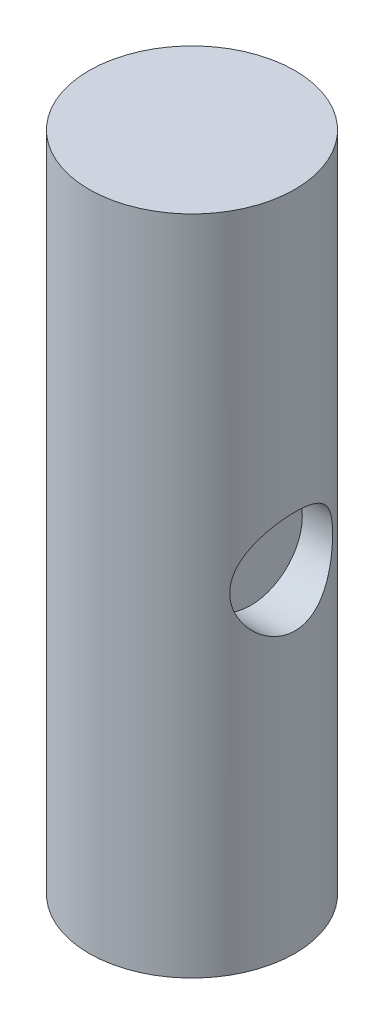
ISO-10303-21;
HEADER;
FILE_DESCRIPTION(('STEP AP214'),'2;1');
FILE_NAME('part.step','',(''),(''),'','','');
FILE_SCHEMA(('AUTOMOTIVE_DESIGN { 1 0 10303 214 1 1 1 1 }'));
ENDSEC;
DATA;
#1=APPLICATION_CONTEXT('core data for automotive mechanical design processes');
#2=APPLICATION_PROTOCOL_DEFINITION('international standard','automotive_design',2000,#1);
#3=PRODUCT_CONTEXT('',#1,'mechanical');
#4=PRODUCT('Part','Part','',(#3));
#5=PRODUCT_RELATED_PRODUCT_CATEGORY('part','',(#4));
#6=PRODUCT_DEFINITION_FORMATION('','',#4);
#7=PRODUCT_DEFINITION_CONTEXT('part definition',#1,'design');
#8=PRODUCT_DEFINITION('design','',#6,#7);
#9=PRODUCT_DEFINITION_SHAPE('','',#8);
#10=(LENGTH_UNIT() NAMED_UNIT(*) SI_UNIT(.MILLI.,.METRE.));
#11=(NAMED_UNIT(*) PLANE_ANGLE_UNIT() SI_UNIT($,.RADIAN.));
#12=(NAMED_UNIT(*) SI_UNIT($,.STERADIAN.) SOLID_ANGLE_UNIT());
#13=UNCERTAINTY_MEASURE_WITH_UNIT(LENGTH_MEASURE(1.E-05),#10,'distance_accuracy_value','');
#14=(GEOMETRIC_REPRESENTATION_CONTEXT(3) GLOBAL_UNCERTAINTY_ASSIGNED_CONTEXT((#13)) GLOBAL_UNIT_ASSIGNED_CONTEXT((#10,
#11,#12)) REPRESENTATION_CONTEXT('',''));
#15=CARTESIAN_POINT('',(0.,0.,0.));
#16=DIRECTION('',(0.,0.,1.));
#17=DIRECTION('',(1.,0.,0.));
#18=AXIS2_PLACEMENT_3D('',#15,#16,#17);
#19=CARTESIAN_POINT('',(0.,45.,0.));
#20=DIRECTION('',(0.,-1.,0.));
#21=DIRECTION('',(0.,0.,-1.));
#22=AXIS2_PLACEMENT_3D('',#19,#20,#21);
#23=CYLINDRICAL_SURFACE('',#22,7.);
#24=CARTESIAN_POINT('',(6.06217782649107,22.5,-3.5));
#25=CARTESIAN_POINT('',(6.06217838000061,22.4087678397001,-3.49999956339732));
#26=CARTESIAN_POINT('',(6.06424447605956,22.3175275619315,-3.49642792389145));
#27=CARTESIAN_POINT('',(6.07243150824313,22.1357513494497,-3.48218913508999));
#28=CARTESIAN_POINT('',(6.07855433209937,22.045215762506,-3.47151868246889));
#29=CARTESIAN_POINT('',(6.09464039096269,21.8654405017537,-3.44319969467244));
#30=CARTESIAN_POINT('',(6.10460964860236,21.7762030891142,-3.42554021516251));
#31=CARTESIAN_POINT('',(6.12802725620062,21.5997877798301,-3.38346810867625));
#32=CARTESIAN_POINT('',(6.1414771178296,21.5126107960543,-3.35905254712793));
#33=CARTESIAN_POINT('',(6.18621982567766,21.2560219225557,-3.27637383514563));
#34=CARTESIAN_POINT('',(6.22201962971363,21.0903861118881,-3.20849068342822));
#35=CARTESIAN_POINT('',(6.30149515669602,20.7729878953145,-3.04943048822246));
#36=CARTESIAN_POINT('',(6.34517130568186,20.621226240545,-2.95825218456469));
#37=CARTESIAN_POINT('',(6.43989014203716,20.3219373472097,-2.74633222566438));
#38=CARTESIAN_POINT('',(6.49124329448661,20.1757917304875,-2.62377249633983));
#39=CARTESIAN_POINT('',(6.59301832981095,19.9050719358753,-2.35639796160147));
#40=CARTESIAN_POINT('',(6.64343973703042,19.7805085179582,-2.21157212276478));
#41=CARTESIAN_POINT('',(6.74175654692166,19.5482015355274,-1.89167303586647));
#42=CARTESIAN_POINT('',(6.7892525767614,19.4421577351831,-1.71521894349515));
#43=CARTESIAN_POINT('',(6.85154168585872,19.3070085831557,-1.43717634193612));
#44=CARTESIAN_POINT('',(6.87081779646073,19.2659340128136,-1.34223033670876));
#45=CARTESIAN_POINT('',(6.9058351653357,19.1921880594991,-1.14851918972932));
#46=CARTESIAN_POINT('',(6.92157840843028,19.1595119566255,-1.0497562291509));
#47=CARTESIAN_POINT('',(6.94806564699471,19.1049828946943,-0.85629304727114));
#48=CARTESIAN_POINT('',(6.95908444384902,19.0825279653702,-0.76179942391877));
#49=CARTESIAN_POINT('',(6.97733380252561,19.0455179066255,-0.570959543899398));
#50=CARTESIAN_POINT('',(6.98456621788415,19.0309589118055,-0.474614217683192));
#51=CARTESIAN_POINT('',(6.99503586222835,19.0099266106036,-0.280849674758711));
#52=CARTESIAN_POINT('',(6.99827423651509,19.0034509862889,-0.18343077398869));
#53=CARTESIAN_POINT('',(7.00067156571555,18.9986576473909,0.0116273304509088));
#54=CARTESIAN_POINT('',(6.9998307702139,19.0003394336951,0.109266520276701));
#55=CARTESIAN_POINT('',(6.99169222403876,19.0166250613422,0.384295104683937));
#56=CARTESIAN_POINT('',(6.97964409624937,19.0407362366605,0.561092380246748));
#57=CARTESIAN_POINT('',(6.94310184431136,19.115079771092,0.907630020967149));
#58=CARTESIAN_POINT('',(6.91860678883803,19.1653140848406,1.07736985703299));
#59=CARTESIAN_POINT('',(6.85900450614999,19.2907900220937,1.4080742192286));
#60=CARTESIAN_POINT('',(6.82375514375715,19.3663680167707,1.56888484366596));
#61=CARTESIAN_POINT('',(6.7458179194099,19.5399210357068,1.8759209447004));
#62=CARTESIAN_POINT('',(6.70312739566786,19.6379040784298,2.02214117261599));
#63=CARTESIAN_POINT('',(6.60955344260832,19.864136623342,2.31060792075682));
#64=CARTESIAN_POINT('',(6.55827701738784,19.9943716146309,2.45117227638486));
#65=CARTESIAN_POINT('',(6.45590306396165,20.2760530133303,2.70936227995222));
#66=CARTESIAN_POINT('',(6.40480570282283,20.427515587783,2.82697027930841));
#67=CARTESIAN_POINT('',(6.30504098213601,20.7593125059831,3.04328139203151));
#68=CARTESIAN_POINT('',(6.25673399939454,20.9408695092446,3.14030968987606));
#69=CARTESIAN_POINT('',(6.19401060186596,21.2254902302643,3.26133310964906));
#70=CARTESIAN_POINT('',(6.17472270909651,21.322432362783,3.2975926372931));
#71=CARTESIAN_POINT('',(6.14014885681131,21.519776704477,3.36153180341711));
#72=CARTESIAN_POINT('',(6.12486043038763,21.6201767373287,3.38921673273672));
#73=CARTESIAN_POINT('',(6.09998031990017,21.8156002235405,3.43377916012519));
#74=CARTESIAN_POINT('',(6.09003479308439,21.9104243298566,3.45133612498609));
#75=CARTESIAN_POINT('',(6.074515266829,22.1015077784056,3.47857887058632));
#76=CARTESIAN_POINT('',(6.06893899406988,22.1977663476854,3.48826874466199));
#77=CARTESIAN_POINT('',(6.0623927334111,22.3908828412676,3.49963441115529));
#78=CARTESIAN_POINT('',(6.06142103030645,22.4877405289337,3.50131318771325));
#79=CARTESIAN_POINT('',(6.06411112066564,22.6811675375594,3.4966486629301));
#80=CARTESIAN_POINT('',(6.06777260137102,22.7777368775425,3.49030590307485));
#81=CARTESIAN_POINT('',(6.08421908511994,23.0446689920494,3.4616182443679));
#82=CARTESIAN_POINT('',(6.10189020770591,23.2138959453071,3.43065523616977));
#83=CARTESIAN_POINT('',(6.14928610781903,23.5443193959298,3.34493911922501));
#84=CARTESIAN_POINT('',(6.1790147886689,23.705513273802,3.29017830614363));
#85=CARTESIAN_POINT('',(6.2487691031854,24.0239304545732,3.15576595224878));
#86=CARTESIAN_POINT('',(6.28920787148186,24.1806240825548,3.07507905936516));
#87=CARTESIAN_POINT('',(6.37546382424484,24.4791449280937,2.89200488769887));
#88=CARTESIAN_POINT('',(6.42128376619316,24.6209644526134,2.78960646141122));
#89=CARTESIAN_POINT('',(6.52008005997018,24.9044248977372,2.55093003311769));
#90=CARTESIAN_POINT('',(6.57323044098861,25.04378981605,2.41200843915968));
#91=CARTESIAN_POINT('',(6.67569819362743,25.2979430445107,2.11191574784142));
#92=CARTESIAN_POINT('',(6.72501426692928,25.4127230529548,1.95073716497934));
#93=CARTESIAN_POINT('',(6.81594766774415,25.6170079821693,1.60487376517276));
#94=CARTESIAN_POINT('',(6.85732746098029,25.7057658988636,1.41968084087148));
#95=CARTESIAN_POINT('',(6.92591742111843,25.8499826783624,1.03432827688115));
#96=CARTESIAN_POINT('',(6.95314002739457,25.9054707806489,0.834181953644699));
#97=CARTESIAN_POINT('',(6.98836278752708,25.976789973824,0.444428889271714));
#98=CARTESIAN_POINT('',(6.99789747919145,25.9957925748211,0.255540058258725));
#99=CARTESIAN_POINT('',(7.00147456072567,26.002951419839,-0.122940955609661));
#100=CARTESIAN_POINT('',(6.99552237388753,25.9911184620464,-0.312532869036781));
#101=CARTESIAN_POINT('',(6.96968891722386,25.9390426115115,-0.673882956292396));
#102=CARTESIAN_POINT('',(6.95075134182771,25.9007231560588,-0.845993051456527));
#103=CARTESIAN_POINT('',(6.90172324976767,25.7993553739606,-1.18106089353429));
#104=CARTESIAN_POINT('',(6.87163113372997,25.7363035010262,-1.34401732410582));
#105=CARTESIAN_POINT('',(6.80140768663223,25.5844558165377,-1.66398168539688));
#106=CARTESIAN_POINT('',(6.76090202225989,25.4946742682379,-1.82043709959406));
#107=CARTESIAN_POINT('',(6.67408423946859,25.293145341654,-2.11671214661926));
#108=CARTESIAN_POINT('',(6.62776945772402,25.181387874567,-2.25652409118354));
#109=CARTESIAN_POINT('',(6.52850308617827,24.9262178238933,-2.53019531440924));
#110=CARTESIAN_POINT('',(6.47534971402989,24.7807617929154,-2.66207744722746));
#111=CARTESIAN_POINT('',(6.37220091113588,24.4688919500999,-2.90033596726623));
#112=CARTESIAN_POINT('',(6.32220830280382,24.3024597936472,-3.00668978938671));
#113=CARTESIAN_POINT('',(6.25338904021468,24.0370462420862,-3.14609819272059));
#114=CARTESIAN_POINT('',(6.23118088900335,23.9443615682369,-3.18972977002774));
#115=CARTESIAN_POINT('',(6.19001580347162,23.7549211671086,-3.26889800450942));
#116=CARTESIAN_POINT('',(6.1710571957288,23.658167567375,-3.30443883130347));
#117=CARTESIAN_POINT('',(6.13719418126031,23.4615144887952,-3.36691395764372));
#118=CARTESIAN_POINT('',(6.1222793598748,23.3616238450393,-3.39387039794445));
#119=CARTESIAN_POINT('',(6.09710349334749,23.1593354986716,-3.43889497857826));
#120=CARTESIAN_POINT('',(6.08683919484421,23.0569396016766,-3.45696933329418));
#121=CARTESIAN_POINT('',(6.07353278780424,22.8787014791471,-3.48027615598228));
#122=CARTESIAN_POINT('',(6.06928503621559,22.8032230485278,-3.48766550855653));
#123=CARTESIAN_POINT('',(6.06360723100921,22.651831638126,-3.4975277766738));
#124=CARTESIAN_POINT('',(6.0621773658894,22.5759186296137,-3.5000003633179));
#125=CARTESIAN_POINT('',(6.06217782649107,22.5,-3.5));
#126=B_SPLINE_CURVE_WITH_KNOTS('',3,(#24,#25,#26,#27,#28,#29,#30,#31,#32,#33,#34,#35,#36,#37,
#38,#39,#40,#41,#42,#43,#44,#45,#46,#47,#48,#49,#50,#51,#52,#53,#54,#55,#56,#57,#58,#59,#60,#61,
#62,#63,#64,#65,#66,#67,#68,#69,#70,#71,#72,#73,#74,#75,#76,#77,#78,#79,#80,#81,#82,#83,#84,#85,
#86,#87,#88,#89,#90,#91,#92,#93,#94,#95,#96,#97,#98,#99,#100,#101,#102,#103,#104,#105,#106,#107,
#108,#109,#110,#111,#112,#113,#114,#115,#116,#117,#118,#119,#120,#121,#122,#123,#124,#125),
.UNSPECIFIED.,.T.,.F.,(4,2,2,2,2,2,2,2,2,2,2,2,2,2,2,2,2,2,2,2,2,2,2,2,2,2,2,2,2,2,2,2,2,2,2,2,
2,2,2,2,2,2,2,2,2,2,2,2,2,2,4),(0.,0.273617669189542,0.547362751371638,0.821538206448541,
1.09583293983044,1.64090790070131,2.18601235407281,2.7760759087586,3.36643280296777,
3.99658404337151,4.31189694333943,4.62703224947414,4.91988214563307,5.21258854947495,
5.50521099950819,5.7978155456191,6.33156812856654,6.86536065471863,7.40653843219784,
7.94791019386722,8.54045641759887,9.13345640521485,9.76411417713839,10.0795717502392,
10.3948342849403,10.6852664033651,10.9755473096532,11.2657200776223,11.5558732588123,
12.0721264170602,12.5885468324815,13.1288853714324,13.669502014921,14.2782660225408,
14.8872352714564,15.5122763466731,16.1367672905263,16.7039594608513,17.2709530350083,
17.8005848677215,18.3302926701398,18.8826562724008,19.4352740507445,20.0428884619716,
20.6510379967997,20.9651345817896,21.2790689268034,21.592186891934,21.9050854699481,
22.1327605463739,22.3604508522341),.UNSPECIFIED.);
#127=CARTESIAN_POINT('',(6.06217782649107,22.5,-3.5));
#128=VERTEX_POINT('',#127);
#129=EDGE_CURVE('E56',#128,#128,#126,.T.);
#130=ORIENTED_EDGE('',*,*,#129,.T.);
#131=EDGE_LOOP('',(#130));
#132=FACE_BOUND('',#131,.T.);
#133=CARTESIAN_POINT('',(0.,45.,0.));
#134=DIRECTION('',(0.,1.,0.));
#135=DIRECTION('',(0.,0.,1.));
#136=AXIS2_PLACEMENT_3D('',#133,#134,#135);
#137=CIRCLE('',#136,7.);
#138=CARTESIAN_POINT('',(0.,45.,7.));
#139=VERTEX_POINT('',#138);
#140=EDGE_CURVE('E10',#139,#139,#137,.T.);
#141=ORIENTED_EDGE('',*,*,#140,.F.);
#142=EDGE_LOOP('',(#141));
#143=FACE_BOUND('',#142,.T.);
#144=CARTESIAN_POINT('',(0.,0.,0.));
#145=DIRECTION('',(0.,1.,0.));
#146=DIRECTION('',(0.,0.,1.));
#147=AXIS2_PLACEMENT_3D('',#144,#145,#146);
#148=CIRCLE('',#147,7.);
#149=CARTESIAN_POINT('',(0.,0.,7.));
#150=VERTEX_POINT('',#149);
#151=EDGE_CURVE('E50',#150,#150,#148,.T.);
#152=ORIENTED_EDGE('',*,*,#151,.T.);
#153=EDGE_LOOP('',(#152));
#154=FACE_BOUND('',#153,.T.);
#155=CARTESIAN_POINT('',(-6.06217782649107,22.5,3.5));
#156=CARTESIAN_POINT('',(-6.06217838000061,22.5912321602999,3.49999956339732));
#157=CARTESIAN_POINT('',(-6.06424447605956,22.6824724380685,3.49642792389145));
#158=CARTESIAN_POINT('',(-6.07243150824313,22.8642486505503,3.48218913508999));
#159=CARTESIAN_POINT('',(-6.07855433209937,22.9547842374941,3.47151868246889));
#160=CARTESIAN_POINT('',(-6.09464039096269,23.1345594982464,3.44319969467244));
#161=CARTESIAN_POINT('',(-6.10460964860236,23.2237969108859,3.42554021516251));
#162=CARTESIAN_POINT('',(-6.12802725620062,23.40021222017,3.38346810867625));
#163=CARTESIAN_POINT('',(-6.1414771178296,23.4873892039457,3.35905254712793));
#164=CARTESIAN_POINT('',(-6.18621982567766,23.7439780774443,3.27637383514563));
#165=CARTESIAN_POINT('',(-6.22201962971363,23.9096138881119,3.20849068342822));
#166=CARTESIAN_POINT('',(-6.30149515669602,24.2270121046855,3.04943048822246));
#167=CARTESIAN_POINT('',(-6.34517130568186,24.378773759455,2.95825218456469));
#168=CARTESIAN_POINT('',(-6.43989014203716,24.6780626527903,2.74633222566438));
#169=CARTESIAN_POINT('',(-6.49124329448661,24.8242082695126,2.62377249633983));
#170=CARTESIAN_POINT('',(-6.59301832981095,25.0949280641247,2.35639796160147));
#171=CARTESIAN_POINT('',(-6.64343973703042,25.2194914820419,2.21157212276478));
#172=CARTESIAN_POINT('',(-6.74175654692166,25.4517984644726,1.89167303586647));
#173=CARTESIAN_POINT('',(-6.7892525767614,25.557842264817,1.71521894349515));
#174=CARTESIAN_POINT('',(-6.85154168585872,25.6929914168443,1.43717634193611));
#175=CARTESIAN_POINT('',(-6.87081779646073,25.7340659871864,1.34223033670875));
#176=CARTESIAN_POINT('',(-6.9058351653357,25.807811940501,1.14851918972932));
#177=CARTESIAN_POINT('',(-6.92157840843028,25.8404880433745,1.0497562291509));
#178=CARTESIAN_POINT('',(-6.94806564699471,25.8950171053057,0.856293047271138));
#179=CARTESIAN_POINT('',(-6.95908444384902,25.9174720346298,0.761799423918767));
#180=CARTESIAN_POINT('',(-6.97733380252561,25.9544820933745,0.570959543899394));
#181=CARTESIAN_POINT('',(-6.98456621788415,25.9690410881945,0.474614217683188));
#182=CARTESIAN_POINT('',(-6.99503586222835,25.9900733893964,0.280849674758708));
#183=CARTESIAN_POINT('',(-6.99827423651509,25.9965490137111,0.183430773988687));
#184=CARTESIAN_POINT('',(-7.00067156571555,26.0013423526091,-0.0116273304509118));
#185=CARTESIAN_POINT('',(-6.9998307702139,25.9996605663049,-0.109266520276704));
#186=CARTESIAN_POINT('',(-6.99169222403876,25.9833749386579,-0.38429510468394));
#187=CARTESIAN_POINT('',(-6.97964409624937,25.9592637633395,-0.561092380246752));
#188=CARTESIAN_POINT('',(-6.94310184431136,25.8849202289081,-0.907630020967152));
#189=CARTESIAN_POINT('',(-6.91860678883803,25.8346859151594,-1.07736985703299));
#190=CARTESIAN_POINT('',(-6.85900450614999,25.7092099779063,-1.4080742192286));
#191=CARTESIAN_POINT('',(-6.82375514375715,25.6336319832294,-1.56888484366596));
#192=CARTESIAN_POINT('',(-6.7458179194099,25.4600789642932,-1.8759209447004));
#193=CARTESIAN_POINT('',(-6.70312739566786,25.3620959215702,-2.02214117261599));
#194=CARTESIAN_POINT('',(-6.60955344260832,25.135863376658,-2.31060792075682));
#195=CARTESIAN_POINT('',(-6.55827701738784,25.0056283853692,-2.45117227638486));
#196=CARTESIAN_POINT('',(-6.45590306396165,24.7239469866697,-2.70936227995222));
#197=CARTESIAN_POINT('',(-6.40480570282283,24.5724844122171,-2.82697027930841));
#198=CARTESIAN_POINT('',(-6.30504098213601,24.2406874940169,-3.04328139203151));
#199=CARTESIAN_POINT('',(-6.25673399939454,24.0591304907554,-3.14030968987606));
#200=CARTESIAN_POINT('',(-6.19401060186596,23.7745097697357,-3.26133310964906));
#201=CARTESIAN_POINT('',(-6.17472270909651,23.677567637217,-3.2975926372931));
#202=CARTESIAN_POINT('',(-6.14014885681131,23.4802232955231,-3.36153180341711));
#203=CARTESIAN_POINT('',(-6.12486043038763,23.3798232626714,-3.38921673273672));
#204=CARTESIAN_POINT('',(-6.09998031990017,23.1843997764595,-3.43377916012519));
#205=CARTESIAN_POINT('',(-6.09003479308439,23.0895756701434,-3.45133612498609));
#206=CARTESIAN_POINT('',(-6.074515266829,22.8984922215944,-3.47857887058632));
#207=CARTESIAN_POINT('',(-6.06893899406988,22.8022336523146,-3.48826874466199));
#208=CARTESIAN_POINT('',(-6.0623927334111,22.6091171587324,-3.49963441115529));
#209=CARTESIAN_POINT('',(-6.06142103030645,22.5122594710663,-3.50131318771325));
#210=CARTESIAN_POINT('',(-6.06411112066564,22.3188324624406,-3.4966486629301));
#211=CARTESIAN_POINT('',(-6.06777260137102,22.2222631224575,-3.49030590307485));
#212=CARTESIAN_POINT('',(-6.08421908511994,21.9553310079506,-3.46161824436789));
#213=CARTESIAN_POINT('',(-6.10189020770591,21.786104054693,-3.43065523616977));
#214=CARTESIAN_POINT('',(-6.14928610781903,21.4556806040702,-3.344939119225));
#215=CARTESIAN_POINT('',(-6.1790147886689,21.2944867261981,-3.29017830614363));
#216=CARTESIAN_POINT('',(-6.2487691031854,20.9760695454268,-3.15576595224878));
#217=CARTESIAN_POINT('',(-6.28920787148186,20.8193759174452,-3.07507905936516));
#218=CARTESIAN_POINT('',(-6.37546382424485,20.5208550719063,-2.89200488769887));
#219=CARTESIAN_POINT('',(-6.42128376619316,20.3790355473866,-2.78960646141122));
#220=CARTESIAN_POINT('',(-6.52008005997018,20.0955751022628,-2.55093003311768));
#221=CARTESIAN_POINT('',(-6.57323044098861,19.95621018395,-2.41200843915967));
#222=CARTESIAN_POINT('',(-6.67569819362743,19.7020569554894,-2.11191574784142));
#223=CARTESIAN_POINT('',(-6.72501426692928,19.5872769470453,-1.95073716497934));
#224=CARTESIAN_POINT('',(-6.81594766774415,19.3829920178308,-1.60487376517276));
#225=CARTESIAN_POINT('',(-6.85732746098029,19.2942341011364,-1.41968084087148));
#226=CARTESIAN_POINT('',(-6.92591742111843,19.1500173216377,-1.03432827688115));
#227=CARTESIAN_POINT('',(-6.95314002739457,19.0945292193511,-0.834181953644697));
#228=CARTESIAN_POINT('',(-6.98836278752708,19.023210026176,-0.444428889271712));
#229=CARTESIAN_POINT('',(-6.99789747919145,19.0042074251789,-0.255540058258723));
#230=CARTESIAN_POINT('',(-7.00147456072567,18.997048580161,0.122940955609663));
#231=CARTESIAN_POINT('',(-6.99552237388753,19.0088815379536,0.312532869036784));
#232=CARTESIAN_POINT('',(-6.96968891722386,19.0609573884885,0.673882956292398));
#233=CARTESIAN_POINT('',(-6.95075134182771,19.0992768439412,0.845993051456528));
#234=CARTESIAN_POINT('',(-6.90172324976767,19.2006446260395,1.18106089353429));
#235=CARTESIAN_POINT('',(-6.87163113372996,19.2636964989738,1.34401732410582));
#236=CARTESIAN_POINT('',(-6.80140768663223,19.4155441834623,1.66398168539688));
#237=CARTESIAN_POINT('',(-6.76090202225989,19.5053257317622,1.82043709959406));
#238=CARTESIAN_POINT('',(-6.67408423946859,19.706854658346,2.11671214661926));
#239=CARTESIAN_POINT('',(-6.62776945772402,19.8186121254331,2.25652409118354));
#240=CARTESIAN_POINT('',(-6.52850308617827,20.0737821761067,2.53019531440925));
#241=CARTESIAN_POINT('',(-6.47534971402989,20.2192382070846,2.66207744722746));
#242=CARTESIAN_POINT('',(-6.37220091113588,20.5311080499002,2.90033596726623));
#243=CARTESIAN_POINT('',(-6.32220830280382,20.6975402063528,3.00668978938671));
#244=CARTESIAN_POINT('',(-6.25338904021468,20.9629537579138,3.14609819272059));
#245=CARTESIAN_POINT('',(-6.23118088900335,21.0556384317632,3.18972977002774));
#246=CARTESIAN_POINT('',(-6.19001580347162,21.2450788328915,3.26889800450942));
#247=CARTESIAN_POINT('',(-6.17105719572879,21.341832432625,3.30443883130347));
#248=CARTESIAN_POINT('',(-6.13719418126031,21.5384855112048,3.36691395764373));
#249=CARTESIAN_POINT('',(-6.1222793598748,21.6383761549607,3.39387039794445));
#250=CARTESIAN_POINT('',(-6.09710349334749,21.8406645013284,3.43889497857826));
#251=CARTESIAN_POINT('',(-6.08683919484421,21.9430603983234,3.45696933329418));
#252=CARTESIAN_POINT('',(-6.07353278780424,22.1212985208529,3.48027615598228));
#253=CARTESIAN_POINT('',(-6.06928503621559,22.1967769514722,3.48766550855653));
#254=CARTESIAN_POINT('',(-6.06360723100921,22.348168361874,3.4975277766738));
#255=CARTESIAN_POINT('',(-6.0621773658894,22.4240813703863,3.5000003633179));
#256=CARTESIAN_POINT('',(-6.06217782649107,22.5,3.5));
#257=B_SPLINE_CURVE_WITH_KNOTS('',3,(#155,#156,#157,#158,#159,#160,#161,#162,#163,#164,#165,
#166,#167,#168,#169,#170,#171,#172,#173,#174,#175,#176,#177,#178,#179,#180,#181,#182,#183,#184,
#185,#186,#187,#188,#189,#190,#191,#192,#193,#194,#195,#196,#197,#198,#199,#200,#201,#202,#203,
#204,#205,#206,#207,#208,#209,#210,#211,#212,#213,#214,#215,#216,#217,#218,#219,#220,#221,#222,
#223,#224,#225,#226,#227,#228,#229,#230,#231,#232,#233,#234,#235,#236,#237,#238,#239,#240,#241,
#242,#243,#244,#245,#246,#247,#248,#249,#250,#251,#252,#253,#254,#255,#256),.UNSPECIFIED.,.T.,
.F.,(4,2,2,2,2,2,2,2,2,2,2,2,2,2,2,2,2,2,2,2,2,2,2,2,2,2,2,2,2,2,2,2,2,2,2,2,2,2,2,2,2,2,2,2,2,
2,2,2,2,2,4),(0.,0.273617669189542,0.547362751371638,0.821538206448541,1.09583293983044,
1.64090790070131,2.18601235407281,2.77607590875861,3.36643280296777,3.99658404337151,
4.31189694333943,4.62703224947414,4.91988214563307,5.21258854947495,5.50521099950819,
5.7978155456191,6.33156812856654,6.86536065471863,7.40653843219784,7.94791019386722,
8.54045641759887,9.13345640521485,9.7641141771384,10.0795717502392,10.3948342849403,
10.6852664033651,10.9755473096532,11.2657200776223,11.5558732588124,12.0721264170602,
12.5885468324815,13.1288853714324,13.669502014921,14.2782660225408,14.8872352714564,
15.5122763466731,16.1367672905263,16.7039594608513,17.2709530350083,17.8005848677215,
18.3302926701398,18.8826562724008,19.4352740507445,20.0428884619717,20.6510379967997,
20.9651345817897,21.2790689268034,21.592186891934,21.9050854699481,22.1327605463739,
22.3604508522341),.UNSPECIFIED.);
#258=CARTESIAN_POINT('',(-6.06217782649107,22.5,3.5));
#259=VERTEX_POINT('',#258);
#260=EDGE_CURVE('E41',#259,#259,#257,.T.);
#261=ORIENTED_EDGE('',*,*,#260,.F.);
#262=EDGE_LOOP('',(#261));
#263=FACE_BOUND('',#262,.T.);
#264=ADVANCED_FACE('F37',(#132,#143,#154,#263),#23,.T.);
#265=CARTESIAN_POINT('',(0.,45.,0.));
#266=DIRECTION('',(0.,1.,0.));
#267=DIRECTION('',(0.,0.,1.));
#268=AXIS2_PLACEMENT_3D('',#265,#266,#267);
#269=PLANE('',#268);
#270=ORIENTED_EDGE('',*,*,#140,.T.);
#271=EDGE_LOOP('',(#270));
#272=FACE_BOUND('',#271,.T.);
#273=ADVANCED_FACE('F75',(#272),#269,.T.);
#274=CARTESIAN_POINT('',(0.,0.,0.));
#275=DIRECTION('',(0.,1.,0.));
#276=DIRECTION('',(0.,0.,1.));
#277=AXIS2_PLACEMENT_3D('',#274,#275,#276);
#278=PLANE('',#277);
#279=ORIENTED_EDGE('',*,*,#151,.F.);
#280=EDGE_LOOP('',(#279));
#281=FACE_BOUND('',#280,.T.);
#282=ADVANCED_FACE('F73',(#281),#278,.F.);
#283=CARTESIAN_POINT('',(4.,22.5,0.));
#284=DIRECTION('',(1.,0.,0.));
#285=DIRECTION('',(0.,0.,-1.));
#286=AXIS2_PLACEMENT_3D('',#283,#284,#285);
#287=CYLINDRICAL_SURFACE('',#286,3.5);
#288=CARTESIAN_POINT('',(4.,22.5,0.));
#289=DIRECTION('',(1.,0.,0.));
#290=DIRECTION('',(0.,0.,-1.));
#291=AXIS2_PLACEMENT_3D('',#288,#289,#290);
#292=CIRCLE('',#291,3.5);
#293=CARTESIAN_POINT('',(4.,22.5,-3.5));
#294=VERTEX_POINT('',#293);
#295=EDGE_CURVE('E59',#294,#294,#292,.T.);
#296=ORIENTED_EDGE('',*,*,#295,.F.);
#297=EDGE_LOOP('',(#296));
#298=FACE_BOUND('',#297,.T.);
#299=ORIENTED_EDGE('',*,*,#129,.F.);
#300=EDGE_LOOP('',(#299));
#301=FACE_BOUND('',#300,.T.);
#302=ADVANCED_FACE('F67',(#298,#301),#287,.F.);
#303=CARTESIAN_POINT('',(4.,0.,0.));
#304=DIRECTION('',(1.,0.,0.));
#305=DIRECTION('',(0.,0.,-1.));
#306=AXIS2_PLACEMENT_3D('',#303,#304,#305);
#307=PLANE('',#306);
#308=ORIENTED_EDGE('',*,*,#295,.T.);
#309=EDGE_LOOP('',(#308));
#310=FACE_BOUND('',#309,.T.);
#311=ADVANCED_FACE('F72',(#310),#307,.T.);
#312=CARTESIAN_POINT('',(-4.,22.5,0.));
#313=DIRECTION('',(-1.,0.,0.));
#314=DIRECTION('',(0.,0.,1.));
#315=AXIS2_PLACEMENT_3D('',#312,#313,#314);
#316=CYLINDRICAL_SURFACE('',#315,3.5);
#317=CARTESIAN_POINT('',(-4.,22.5,0.));
#318=DIRECTION('',(1.,0.,0.));
#319=DIRECTION('',(0.,0.,-1.));
#320=AXIS2_PLACEMENT_3D('',#317,#318,#319);
#321=CIRCLE('',#320,3.5);
#322=CARTESIAN_POINT('',(-4.,22.5,-3.5));
#323=VERTEX_POINT('',#322);
#324=EDGE_CURVE('E94',#323,#323,#321,.T.);
#325=ORIENTED_EDGE('',*,*,#324,.T.);
#326=EDGE_LOOP('',(#325));
#327=FACE_BOUND('',#326,.T.);
#328=ORIENTED_EDGE('',*,*,#260,.T.);
#329=EDGE_LOOP('',(#328));
#330=FACE_BOUND('',#329,.T.);
#331=ADVANCED_FACE('F101',(#327,#330),#316,.F.);
#332=CARTESIAN_POINT('',(-4.,0.,0.));
#333=DIRECTION('',(1.,0.,0.));
#334=DIRECTION('',(0.,0.,-1.));
#335=AXIS2_PLACEMENT_3D('',#332,#333,#334);
#336=PLANE('',#335);
#337=ORIENTED_EDGE('',*,*,#324,.F.);
#338=EDGE_LOOP('',(#337));
#339=FACE_BOUND('',#338,.T.);
#340=ADVANCED_FACE('F103',(#339),#336,.F.);
#341=CLOSED_SHELL('',(#264,#273,#282,#302,#311,#331,#340));
#342=MANIFOLD_SOLID_BREP('B2',#341);
#343=ADVANCED_BREP_SHAPE_REPRESENTATION('',(#18,#342),#14);
#344=SHAPE_DEFINITION_REPRESENTATION(#9,#343);
ENDSEC;
END-ISO-10303-21;
